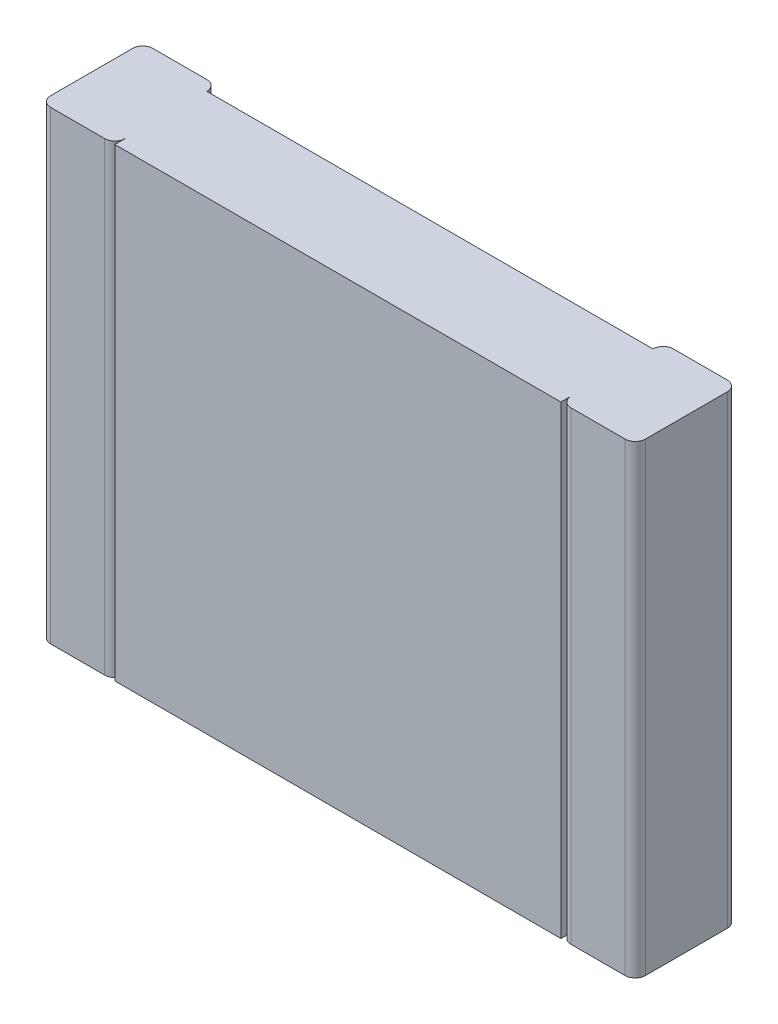
ISO-10303-21;
HEADER;
FILE_DESCRIPTION(('STEP AP214'),'2;1');
FILE_NAME('part.step','',(''),(''),'','','');
FILE_SCHEMA(('AUTOMOTIVE_DESIGN { 1 0 10303 214 1 1 1 1 }'));
ENDSEC;
DATA;
#1=APPLICATION_CONTEXT('core data for automotive mechanical design processes');
#2=APPLICATION_PROTOCOL_DEFINITION('international standard','automotive_design',2000,#1);
#3=PRODUCT_CONTEXT('',#1,'mechanical');
#4=PRODUCT('Part','Part','',(#3));
#5=PRODUCT_RELATED_PRODUCT_CATEGORY('part','',(#4));
#6=PRODUCT_DEFINITION_FORMATION('','',#4);
#7=PRODUCT_DEFINITION_CONTEXT('part definition',#1,'design');
#8=PRODUCT_DEFINITION('design','',#6,#7);
#9=PRODUCT_DEFINITION_SHAPE('','',#8);
#10=(LENGTH_UNIT() NAMED_UNIT(*) SI_UNIT(.MILLI.,.METRE.));
#11=(NAMED_UNIT(*) PLANE_ANGLE_UNIT() SI_UNIT($,.RADIAN.));
#12=(NAMED_UNIT(*) SI_UNIT($,.STERADIAN.) SOLID_ANGLE_UNIT());
#13=UNCERTAINTY_MEASURE_WITH_UNIT(LENGTH_MEASURE(1.E-05),#10,'distance_accuracy_value','');
#14=(GEOMETRIC_REPRESENTATION_CONTEXT(3) GLOBAL_UNCERTAINTY_ASSIGNED_CONTEXT((#13)) GLOBAL_UNIT_ASSIGNED_CONTEXT((#10,
#11,#12)) REPRESENTATION_CONTEXT('',''));
#15=CARTESIAN_POINT('',(0.,0.,0.));
#16=DIRECTION('',(0.,0.,1.));
#17=DIRECTION('',(1.,0.,0.));
#18=AXIS2_PLACEMENT_3D('',#15,#16,#17);
#19=CARTESIAN_POINT('',(-1.6,-1.25,0.55));
#20=DIRECTION('',(0.,0.,1.));
#21=DIRECTION('',(1.,0.,0.));
#22=AXIS2_PLACEMENT_3D('',#19,#20,#21);
#23=PLANE('',#22);
#24=DIRECTION('',(1.,0.,0.));
#25=VECTOR('',#24,1.);
#26=CARTESIAN_POINT('',(-1.6,-1.25,0.55));
#27=LINE('',#26,#25);
#28=CARTESIAN_POINT('',(-1.545,-1.25,0.55));
#29=VERTEX_POINT('',#28);
#30=CARTESIAN_POINT('',(-1.255,-1.25,0.55));
#31=VERTEX_POINT('',#30);
#32=EDGE_CURVE('E147',#29,#31,#27,.T.);
#33=ORIENTED_EDGE('',*,*,#32,.T.);
#34=DIRECTION('',(0.,1.,0.));
#35=VECTOR('',#34,1.);
#36=CARTESIAN_POINT('',(-1.255,-1.25,0.55));
#37=LINE('',#36,#35);
#38=CARTESIAN_POINT('',(-1.255,1.25,0.55));
#39=VERTEX_POINT('',#38);
#40=EDGE_CURVE('E172',#39,#31,#37,.F.);
#41=ORIENTED_EDGE('',*,*,#40,.F.);
#42=DIRECTION('',(1.,0.,0.));
#43=VECTOR('',#42,1.);
#44=CARTESIAN_POINT('',(-1.6,1.25,0.55));
#45=LINE('',#44,#43);
#46=CARTESIAN_POINT('',(-1.545,1.25,0.55));
#47=VERTEX_POINT('',#46);
#48=EDGE_CURVE('E178',#39,#47,#45,.F.);
#49=ORIENTED_EDGE('',*,*,#48,.T.);
#50=DIRECTION('',(0.,1.,0.));
#51=VECTOR('',#50,1.);
#52=CARTESIAN_POINT('',(-1.545,-1.25,0.55));
#53=LINE('',#52,#51);
#54=EDGE_CURVE('E151',#29,#47,#53,.T.);
#55=ORIENTED_EDGE('',*,*,#54,.F.);
#56=EDGE_LOOP('',(#33,#41,#49,#55));
#57=FACE_BOUND('',#56,.T.);
#58=ADVANCED_FACE('F17',(#57),#23,.T.);
#59=CARTESIAN_POINT('',(1.2,-1.25,0.55));
#60=DIRECTION('',(0.,0.,1.));
#61=DIRECTION('',(1.,0.,0.));
#62=AXIS2_PLACEMENT_3D('',#59,#60,#61);
#63=PLANE('',#62);
#64=DIRECTION('',(1.,0.,0.));
#65=VECTOR('',#64,1.);
#66=CARTESIAN_POINT('',(1.2,-1.25,0.55));
#67=LINE('',#66,#65);
#68=CARTESIAN_POINT('',(1.255,-1.25,0.55));
#69=VERTEX_POINT('',#68);
#70=CARTESIAN_POINT('',(1.545,-1.25,0.55));
#71=VERTEX_POINT('',#70);
#72=EDGE_CURVE('E152',#69,#71,#67,.T.);
#73=ORIENTED_EDGE('',*,*,#72,.T.);
#74=DIRECTION('',(0.,1.,0.));
#75=VECTOR('',#74,1.);
#76=CARTESIAN_POINT('',(1.545,-1.25,0.55));
#77=LINE('',#76,#75);
#78=CARTESIAN_POINT('',(1.545,1.25,0.55));
#79=VERTEX_POINT('',#78);
#80=EDGE_CURVE('E180',#79,#71,#77,.F.);
#81=ORIENTED_EDGE('',*,*,#80,.F.);
#82=DIRECTION('',(1.,0.,0.));
#83=VECTOR('',#82,1.);
#84=CARTESIAN_POINT('',(1.2,1.25,0.55));
#85=LINE('',#84,#83);
#86=CARTESIAN_POINT('',(1.255,1.25,0.55));
#87=VERTEX_POINT('',#86);
#88=EDGE_CURVE('E169',#79,#87,#85,.F.);
#89=ORIENTED_EDGE('',*,*,#88,.T.);
#90=DIRECTION('',(0.,1.,0.));
#91=VECTOR('',#90,1.);
#92=CARTESIAN_POINT('',(1.255,-1.25,0.55));
#93=LINE('',#92,#91);
#94=EDGE_CURVE('E165',#69,#87,#93,.T.);
#95=ORIENTED_EDGE('',*,*,#94,.F.);
#96=EDGE_LOOP('',(#73,#81,#89,#95));
#97=FACE_BOUND('',#96,.T.);
#98=ADVANCED_FACE('F226',(#97),#63,.T.);
#99=CARTESIAN_POINT('',(-1.545,-1.25,0.495));
#100=DIRECTION('',(0.,1.,0.));
#101=DIRECTION('',(0.,0.,1.));
#102=AXIS2_PLACEMENT_3D('',#99,#100,#101);
#103=CYLINDRICAL_SURFACE('',#102,0.055);
#104=CARTESIAN_POINT('',(-1.545,1.25,0.495));
#105=DIRECTION('',(0.,1.,0.));
#106=DIRECTION('',(0.,0.,1.));
#107=AXIS2_PLACEMENT_3D('',#104,#105,#106);
#108=CIRCLE('',#107,0.055);
#109=CARTESIAN_POINT('',(-1.6,1.25,0.495));
#110=VERTEX_POINT('',#109);
#111=EDGE_CURVE('E155',#47,#110,#108,.F.);
#112=ORIENTED_EDGE('',*,*,#111,.T.);
#113=DIRECTION('',(0.,1.,0.));
#114=VECTOR('',#113,1.);
#115=CARTESIAN_POINT('',(-1.6,-1.25,0.495));
#116=LINE('',#115,#114);
#117=CARTESIAN_POINT('',(-1.6,-1.25,0.495));
#118=VERTEX_POINT('',#117);
#119=EDGE_CURVE('E133',#110,#118,#116,.F.);
#120=ORIENTED_EDGE('',*,*,#119,.T.);
#121=CARTESIAN_POINT('',(-1.545,-1.25,0.495));
#122=DIRECTION('',(0.,1.,0.));
#123=DIRECTION('',(0.,0.,1.));
#124=AXIS2_PLACEMENT_3D('',#121,#122,#123);
#125=CIRCLE('',#124,0.055);
#126=EDGE_CURVE('E20',#118,#29,#125,.T.);
#127=ORIENTED_EDGE('',*,*,#126,.T.);
#128=ORIENTED_EDGE('',*,*,#54,.T.);
#129=EDGE_LOOP('',(#112,#120,#127,#128));
#130=FACE_BOUND('',#129,.T.);
#131=ADVANCED_FACE('F153',(#130),#103,.T.);
#132=CARTESIAN_POINT('',(1.545,-1.25,0.495));
#133=DIRECTION('',(0.,1.,0.));
#134=DIRECTION('',(0.,0.,1.));
#135=AXIS2_PLACEMENT_3D('',#132,#133,#134);
#136=CYLINDRICAL_SURFACE('',#135,0.055);
#137=ORIENTED_EDGE('',*,*,#80,.T.);
#138=CARTESIAN_POINT('',(1.545,-1.25,0.495));
#139=DIRECTION('',(0.,1.,0.));
#140=DIRECTION('',(0.,0.,1.));
#141=AXIS2_PLACEMENT_3D('',#138,#139,#140);
#142=CIRCLE('',#141,0.055);
#143=CARTESIAN_POINT('',(1.6,-1.25,0.495));
#144=VERTEX_POINT('',#143);
#145=EDGE_CURVE('E183',#71,#144,#142,.T.);
#146=ORIENTED_EDGE('',*,*,#145,.T.);
#147=DIRECTION('',(0.,1.,0.));
#148=VECTOR('',#147,1.);
#149=CARTESIAN_POINT('',(1.6,-1.25,0.495));
#150=LINE('',#149,#148);
#151=CARTESIAN_POINT('',(1.6,1.25,0.495));
#152=VERTEX_POINT('',#151);
#153=EDGE_CURVE('E163',#152,#144,#150,.F.);
#154=ORIENTED_EDGE('',*,*,#153,.F.);
#155=CARTESIAN_POINT('',(1.545,1.25,0.495));
#156=DIRECTION('',(0.,1.,0.));
#157=DIRECTION('',(0.,0.,1.));
#158=AXIS2_PLACEMENT_3D('',#155,#156,#157);
#159=CIRCLE('',#158,0.055);
#160=EDGE_CURVE('E184',#152,#79,#159,.F.);
#161=ORIENTED_EDGE('',*,*,#160,.T.);
#162=EDGE_LOOP('',(#137,#146,#154,#161));
#163=FACE_BOUND('',#162,.T.);
#164=ADVANCED_FACE('F216',(#163),#136,.T.);
#165=CARTESIAN_POINT('',(-1.255,-1.25,0.495));
#166=DIRECTION('',(0.,1.,0.));
#167=DIRECTION('',(0.,0.,1.));
#168=AXIS2_PLACEMENT_3D('',#165,#166,#167);
#169=CYLINDRICAL_SURFACE('',#168,0.055);
#170=ORIENTED_EDGE('',*,*,#40,.T.);
#171=CARTESIAN_POINT('',(-1.255,-1.25,0.495));
#172=DIRECTION('',(0.,1.,0.));
#173=DIRECTION('',(0.,0.,1.));
#174=AXIS2_PLACEMENT_3D('',#171,#172,#173);
#175=CIRCLE('',#174,0.055);
#176=CARTESIAN_POINT('',(-1.2,-1.25,0.495));
#177=VERTEX_POINT('',#176);
#178=EDGE_CURVE('E175',#31,#177,#175,.T.);
#179=ORIENTED_EDGE('',*,*,#178,.T.);
#180=DIRECTION('',(0.,1.,0.));
#181=VECTOR('',#180,1.);
#182=CARTESIAN_POINT('',(-1.2,-1.25,0.495));
#183=LINE('',#182,#181);
#184=CARTESIAN_POINT('',(-1.2,1.25,0.495));
#185=VERTEX_POINT('',#184);
#186=EDGE_CURVE('E239',#177,#185,#183,.T.);
#187=ORIENTED_EDGE('',*,*,#186,.T.);
#188=CARTESIAN_POINT('',(-1.255,1.25,0.495));
#189=DIRECTION('',(0.,1.,0.));
#190=DIRECTION('',(0.,0.,1.));
#191=AXIS2_PLACEMENT_3D('',#188,#189,#190);
#192=CIRCLE('',#191,0.055);
#193=EDGE_CURVE('E176',#185,#39,#192,.F.);
#194=ORIENTED_EDGE('',*,*,#193,.T.);
#195=EDGE_LOOP('',(#170,#179,#187,#194));
#196=FACE_BOUND('',#195,.T.);
#197=ADVANCED_FACE('F309',(#196),#169,.T.);
#198=CARTESIAN_POINT('',(1.255,-1.25,0.495));
#199=DIRECTION('',(0.,1.,0.));
#200=DIRECTION('',(0.,0.,1.));
#201=AXIS2_PLACEMENT_3D('',#198,#199,#200);
#202=CYLINDRICAL_SURFACE('',#201,0.055);
#203=CARTESIAN_POINT('',(1.255,1.25,0.495));
#204=DIRECTION('',(0.,1.,0.));
#205=DIRECTION('',(0.,0.,1.));
#206=AXIS2_PLACEMENT_3D('',#203,#204,#205);
#207=CIRCLE('',#206,0.055);
#208=CARTESIAN_POINT('',(1.2,1.25,0.495));
#209=VERTEX_POINT('',#208);
#210=EDGE_CURVE('E140',#87,#209,#207,.F.);
#211=ORIENTED_EDGE('',*,*,#210,.T.);
#212=DIRECTION('',(0.,1.,0.));
#213=VECTOR('',#212,1.);
#214=CARTESIAN_POINT('',(1.2,-1.25,0.495));
#215=LINE('',#214,#213);
#216=CARTESIAN_POINT('',(1.2,-1.25,0.495));
#217=VERTEX_POINT('',#216);
#218=EDGE_CURVE('E250',#217,#209,#215,.T.);
#219=ORIENTED_EDGE('',*,*,#218,.F.);
#220=CARTESIAN_POINT('',(1.255,-1.25,0.495));
#221=DIRECTION('',(0.,1.,0.));
#222=DIRECTION('',(0.,0.,1.));
#223=AXIS2_PLACEMENT_3D('',#220,#221,#222);
#224=CIRCLE('',#223,0.055);
#225=EDGE_CURVE('E168',#217,#69,#224,.T.);
#226=ORIENTED_EDGE('',*,*,#225,.T.);
#227=ORIENTED_EDGE('',*,*,#94,.T.);
#228=EDGE_LOOP('',(#211,#219,#226,#227));
#229=FACE_BOUND('',#228,.T.);
#230=ADVANCED_FACE('F478',(#229),#202,.T.);
#231=CARTESIAN_POINT('',(-1.6,-1.25,0.));
#232=DIRECTION('',(1.,0.,0.));
#233=DIRECTION('',(0.,0.,-1.));
#234=AXIS2_PLACEMENT_3D('',#231,#232,#233);
#235=PLANE('',#234);
#236=DIRECTION('',(0.,0.,-1.));
#237=VECTOR('',#236,1.);
#238=CARTESIAN_POINT('',(-1.6,1.25,0.));
#239=LINE('',#238,#237);
#240=CARTESIAN_POINT('',(-1.6,1.25,0.055));
#241=VERTEX_POINT('',#240);
#242=EDGE_CURVE('E139',#241,#110,#239,.F.);
#243=ORIENTED_EDGE('',*,*,#242,.F.);
#244=DIRECTION('',(0.,1.,0.));
#245=VECTOR('',#244,1.);
#246=CARTESIAN_POINT('',(-1.6,-1.25,0.055));
#247=LINE('',#246,#245);
#248=CARTESIAN_POINT('',(-1.6,-1.25,0.055));
#249=VERTEX_POINT('',#248);
#250=EDGE_CURVE('E136',#249,#241,#247,.T.);
#251=ORIENTED_EDGE('',*,*,#250,.F.);
#252=DIRECTION('',(0.,0.,-1.));
#253=VECTOR('',#252,1.);
#254=CARTESIAN_POINT('',(-1.6,-1.25,0.));
#255=LINE('',#254,#253);
#256=EDGE_CURVE('E129',#118,#249,#255,.T.);
#257=ORIENTED_EDGE('',*,*,#256,.F.);
#258=ORIENTED_EDGE('',*,*,#119,.F.);
#259=EDGE_LOOP('',(#243,#251,#257,#258));
#260=FACE_BOUND('',#259,.T.);
#261=ADVANCED_FACE('F131',(#260),#235,.F.);
#262=CARTESIAN_POINT('',(1.6,-1.25,0.));
#263=DIRECTION('',(1.,0.,0.));
#264=DIRECTION('',(0.,0.,-1.));
#265=AXIS2_PLACEMENT_3D('',#262,#263,#264);
#266=PLANE('',#265);
#267=DIRECTION('',(0.,0.,-1.));
#268=VECTOR('',#267,1.);
#269=CARTESIAN_POINT('',(1.6,1.25,0.));
#270=LINE('',#269,#268);
#271=CARTESIAN_POINT('',(1.6,1.25,0.055));
#272=VERTEX_POINT('',#271);
#273=EDGE_CURVE('E158',#272,#152,#270,.F.);
#274=ORIENTED_EDGE('',*,*,#273,.T.);
#275=ORIENTED_EDGE('',*,*,#153,.T.);
#276=DIRECTION('',(0.,0.,-1.));
#277=VECTOR('',#276,1.);
#278=CARTESIAN_POINT('',(1.6,-1.25,0.));
#279=LINE('',#278,#277);
#280=CARTESIAN_POINT('',(1.6,-1.25,0.055));
#281=VERTEX_POINT('',#280);
#282=EDGE_CURVE('E156',#144,#281,#279,.T.);
#283=ORIENTED_EDGE('',*,*,#282,.T.);
#284=DIRECTION('',(0.,1.,0.));
#285=VECTOR('',#284,1.);
#286=CARTESIAN_POINT('',(1.6,-1.25,0.055));
#287=LINE('',#286,#285);
#288=EDGE_CURVE('E200',#272,#281,#287,.F.);
#289=ORIENTED_EDGE('',*,*,#288,.F.);
#290=EDGE_LOOP('',(#274,#275,#283,#289));
#291=FACE_BOUND('',#290,.T.);
#292=ADVANCED_FACE('F234',(#291),#266,.T.);
#293=CARTESIAN_POINT('',(-1.2,-1.25,0.495));
#294=DIRECTION('',(1.,0.,0.));
#295=DIRECTION('',(0.,0.,-1.));
#296=AXIS2_PLACEMENT_3D('',#293,#294,#295);
#297=PLANE('',#296);
#298=DIRECTION('',(0.,0.,-1.));
#299=VECTOR('',#298,1.);
#300=CARTESIAN_POINT('',(-1.2,1.25,0.495));
#301=LINE('',#300,#299);
#302=CARTESIAN_POINT('',(-1.2,1.25,0.55));
#303=VERTEX_POINT('',#302);
#304=EDGE_CURVE('E270',#185,#303,#301,.F.);
#305=ORIENTED_EDGE('',*,*,#304,.F.);
#306=ORIENTED_EDGE('',*,*,#186,.F.);
#307=DIRECTION('',(0.,0.,-1.));
#308=VECTOR('',#307,1.);
#309=CARTESIAN_POINT('',(-1.2,-1.25,0.495));
#310=LINE('',#309,#308);
#311=CARTESIAN_POINT('',(-1.2,-1.25,0.55));
#312=VERTEX_POINT('',#311);
#313=EDGE_CURVE('E237',#312,#177,#310,.T.);
#314=ORIENTED_EDGE('',*,*,#313,.F.);
#315=DIRECTION('',(0.,1.,0.));
#316=VECTOR('',#315,1.);
#317=CARTESIAN_POINT('',(-1.2,-1.25,0.55));
#318=LINE('',#317,#316);
#319=EDGE_CURVE('E246',#303,#312,#318,.F.);
#320=ORIENTED_EDGE('',*,*,#319,.F.);
#321=EDGE_LOOP('',(#305,#306,#314,#320));
#322=FACE_BOUND('',#321,.T.);
#323=ADVANCED_FACE('F307',(#322),#297,.F.);
#324=CARTESIAN_POINT('',(1.2,-1.25,0.495));
#325=DIRECTION('',(1.,0.,0.));
#326=DIRECTION('',(0.,0.,-1.));
#327=AXIS2_PLACEMENT_3D('',#324,#325,#326);
#328=PLANE('',#327);
#329=DIRECTION('',(0.,0.,-1.));
#330=VECTOR('',#329,1.);
#331=CARTESIAN_POINT('',(1.2,1.25,0.495));
#332=LINE('',#331,#330);
#333=CARTESIAN_POINT('',(1.2,1.25,0.55));
#334=VERTEX_POINT('',#333);
#335=EDGE_CURVE('E248',#209,#334,#332,.F.);
#336=ORIENTED_EDGE('',*,*,#335,.T.);
#337=DIRECTION('',(0.,1.,0.));
#338=VECTOR('',#337,1.);
#339=CARTESIAN_POINT('',(1.2,-1.25,0.55));
#340=LINE('',#339,#338);
#341=CARTESIAN_POINT('',(1.2,-1.25,0.55));
#342=VERTEX_POINT('',#341);
#343=EDGE_CURVE('E258',#342,#334,#340,.T.);
#344=ORIENTED_EDGE('',*,*,#343,.F.);
#345=DIRECTION('',(0.,0.,-1.));
#346=VECTOR('',#345,1.);
#347=CARTESIAN_POINT('',(1.2,-1.25,0.495));
#348=LINE('',#347,#346);
#349=EDGE_CURVE('E253',#342,#217,#348,.T.);
#350=ORIENTED_EDGE('',*,*,#349,.T.);
#351=ORIENTED_EDGE('',*,*,#218,.T.);
#352=EDGE_LOOP('',(#336,#344,#350,#351));
#353=FACE_BOUND('',#352,.T.);
#354=ADVANCED_FACE('F302',(#353),#328,.T.);
#355=CARTESIAN_POINT('',(-1.545,-1.25,0.055));
#356=DIRECTION('',(0.,1.,0.));
#357=DIRECTION('',(0.,0.,1.));
#358=AXIS2_PLACEMENT_3D('',#355,#356,#357);
#359=CYLINDRICAL_SURFACE('',#358,0.055);
#360=DIRECTION('',(0.,1.,0.));
#361=VECTOR('',#360,1.);
#362=CARTESIAN_POINT('',(-1.545,-1.25,0.));
#363=LINE('',#362,#361);
#364=CARTESIAN_POINT('',(-1.545,1.25,0.));
#365=VERTEX_POINT('',#364);
#366=CARTESIAN_POINT('',(-1.545,-1.25,0.));
#367=VERTEX_POINT('',#366);
#368=EDGE_CURVE('E244',#365,#367,#363,.F.);
#369=ORIENTED_EDGE('',*,*,#368,.T.);
#370=CARTESIAN_POINT('',(-1.545,-1.25,0.055));
#371=DIRECTION('',(0.,1.,0.));
#372=DIRECTION('',(0.,0.,1.));
#373=AXIS2_PLACEMENT_3D('',#370,#371,#372);
#374=CIRCLE('',#373,0.055);
#375=EDGE_CURVE('E203',#367,#249,#374,.T.);
#376=ORIENTED_EDGE('',*,*,#375,.T.);
#377=ORIENTED_EDGE('',*,*,#250,.T.);
#378=CARTESIAN_POINT('',(-1.545,1.25,0.055));
#379=DIRECTION('',(0.,1.,0.));
#380=DIRECTION('',(0.,0.,1.));
#381=AXIS2_PLACEMENT_3D('',#378,#379,#380);
#382=CIRCLE('',#381,0.055);
#383=EDGE_CURVE('E205',#241,#365,#382,.F.);
#384=ORIENTED_EDGE('',*,*,#383,.T.);
#385=EDGE_LOOP('',(#369,#376,#377,#384));
#386=FACE_BOUND('',#385,.T.);
#387=ADVANCED_FACE('F316',(#386),#359,.T.);
#388=CARTESIAN_POINT('',(1.545,-1.25,0.055));
#389=DIRECTION('',(0.,1.,0.));
#390=DIRECTION('',(0.,0.,1.));
#391=AXIS2_PLACEMENT_3D('',#388,#389,#390);
#392=CYLINDRICAL_SURFACE('',#391,0.055);
#393=CARTESIAN_POINT('',(1.545,1.25,0.055));
#394=DIRECTION('',(0.,1.,0.));
#395=DIRECTION('',(0.,0.,1.));
#396=AXIS2_PLACEMENT_3D('',#393,#394,#395);
#397=CIRCLE('',#396,0.055);
#398=CARTESIAN_POINT('',(1.545,1.25,0.));
#399=VERTEX_POINT('',#398);
#400=EDGE_CURVE('E198',#399,#272,#397,.F.);
#401=ORIENTED_EDGE('',*,*,#400,.T.);
#402=ORIENTED_EDGE('',*,*,#288,.T.);
#403=CARTESIAN_POINT('',(1.545,-1.25,0.055));
#404=DIRECTION('',(0.,1.,0.));
#405=DIRECTION('',(0.,0.,1.));
#406=AXIS2_PLACEMENT_3D('',#403,#404,#405);
#407=CIRCLE('',#406,0.055);
#408=CARTESIAN_POINT('',(1.545,-1.25,0.));
#409=VERTEX_POINT('',#408);
#410=EDGE_CURVE('E201',#281,#409,#407,.T.);
#411=ORIENTED_EDGE('',*,*,#410,.T.);
#412=DIRECTION('',(0.,1.,0.));
#413=VECTOR('',#412,1.);
#414=CARTESIAN_POINT('',(1.545,-1.25,0.));
#415=LINE('',#414,#413);
#416=EDGE_CURVE('E276',#409,#399,#415,.T.);
#417=ORIENTED_EDGE('',*,*,#416,.T.);
#418=EDGE_LOOP('',(#401,#402,#411,#417));
#419=FACE_BOUND('',#418,.T.);
#420=ADVANCED_FACE('F436',(#419),#392,.T.);
#421=CARTESIAN_POINT('',(-1.2,-1.25,0.55));
#422=DIRECTION('',(0.,0.,1.));
#423=DIRECTION('',(1.,0.,0.));
#424=AXIS2_PLACEMENT_3D('',#421,#422,#423);
#425=PLANE('',#424);
#426=ORIENTED_EDGE('',*,*,#343,.T.);
#427=DIRECTION('',(1.,0.,0.));
#428=VECTOR('',#427,1.);
#429=CARTESIAN_POINT('',(-1.2,1.25,0.55));
#430=LINE('',#429,#428);
#431=EDGE_CURVE('E263',#303,#334,#430,.T.);
#432=ORIENTED_EDGE('',*,*,#431,.F.);
#433=ORIENTED_EDGE('',*,*,#319,.T.);
#434=DIRECTION('',(1.,0.,0.));
#435=VECTOR('',#434,1.);
#436=CARTESIAN_POINT('',(-1.2,-1.25,0.55));
#437=LINE('',#436,#435);
#438=EDGE_CURVE('E273',#312,#342,#437,.T.);
#439=ORIENTED_EDGE('',*,*,#438,.T.);
#440=EDGE_LOOP('',(#426,#432,#433,#439));
#441=FACE_BOUND('',#440,.T.);
#442=ADVANCED_FACE('F294',(#441),#425,.T.);
#443=CARTESIAN_POINT('',(-1.6,-1.25,0.));
#444=DIRECTION('',(0.,0.,1.));
#445=DIRECTION('',(1.,0.,0.));
#446=AXIS2_PLACEMENT_3D('',#443,#444,#445);
#447=PLANE('',#446);
#448=DIRECTION('',(1.,0.,0.));
#449=VECTOR('',#448,1.);
#450=CARTESIAN_POINT('',(-1.6,-1.25,0.));
#451=LINE('',#450,#449);
#452=CARTESIAN_POINT('',(-1.255,-1.25,0.));
#453=VERTEX_POINT('',#452);
#454=EDGE_CURVE('E277',#453,#367,#451,.F.);
#455=ORIENTED_EDGE('',*,*,#454,.T.);
#456=ORIENTED_EDGE('',*,*,#368,.F.);
#457=DIRECTION('',(1.,0.,0.));
#458=VECTOR('',#457,1.);
#459=CARTESIAN_POINT('',(-1.6,1.25,0.));
#460=LINE('',#459,#458);
#461=CARTESIAN_POINT('',(-1.255,1.25,0.));
#462=VERTEX_POINT('',#461);
#463=EDGE_CURVE('E266',#462,#365,#460,.F.);
#464=ORIENTED_EDGE('',*,*,#463,.F.);
#465=DIRECTION('',(0.,1.,0.));
#466=VECTOR('',#465,1.);
#467=CARTESIAN_POINT('',(-1.255,-1.25,0.));
#468=LINE('',#467,#466);
#469=EDGE_CURVE('E193',#453,#462,#468,.T.);
#470=ORIENTED_EDGE('',*,*,#469,.F.);
#471=EDGE_LOOP('',(#455,#456,#464,#470));
#472=FACE_BOUND('',#471,.T.);
#473=ADVANCED_FACE('F328',(#472),#447,.F.);
#474=CARTESIAN_POINT('',(1.2,-1.25,0.));
#475=DIRECTION('',(0.,0.,1.));
#476=DIRECTION('',(1.,0.,0.));
#477=AXIS2_PLACEMENT_3D('',#474,#475,#476);
#478=PLANE('',#477);
#479=DIRECTION('',(1.,0.,0.));
#480=VECTOR('',#479,1.);
#481=CARTESIAN_POINT('',(1.2,-1.25,0.));
#482=LINE('',#481,#480);
#483=CARTESIAN_POINT('',(1.255,-1.25,0.));
#484=VERTEX_POINT('',#483);
#485=EDGE_CURVE('E333',#409,#484,#482,.F.);
#486=ORIENTED_EDGE('',*,*,#485,.T.);
#487=DIRECTION('',(0.,1.,0.));
#488=VECTOR('',#487,1.);
#489=CARTESIAN_POINT('',(1.255,-1.25,0.));
#490=LINE('',#489,#488);
#491=CARTESIAN_POINT('',(1.255,1.25,0.));
#492=VERTEX_POINT('',#491);
#493=EDGE_CURVE('E189',#492,#484,#490,.F.);
#494=ORIENTED_EDGE('',*,*,#493,.F.);
#495=DIRECTION('',(1.,0.,0.));
#496=VECTOR('',#495,1.);
#497=CARTESIAN_POINT('',(1.2,1.25,0.));
#498=LINE('',#497,#496);
#499=EDGE_CURVE('E197',#399,#492,#498,.F.);
#500=ORIENTED_EDGE('',*,*,#499,.F.);
#501=ORIENTED_EDGE('',*,*,#416,.F.);
#502=EDGE_LOOP('',(#486,#494,#500,#501));
#503=FACE_BOUND('',#502,.T.);
#504=ADVANCED_FACE('F354',(#503),#478,.F.);
#505=CARTESIAN_POINT('',(-1.255,-1.25,0.055));
#506=DIRECTION('',(0.,1.,0.));
#507=DIRECTION('',(0.,0.,1.));
#508=AXIS2_PLACEMENT_3D('',#505,#506,#507);
#509=CYLINDRICAL_SURFACE('',#508,0.055);
#510=CARTESIAN_POINT('',(-1.255,1.25,0.055));
#511=DIRECTION('',(0.,1.,0.));
#512=DIRECTION('',(0.,0.,1.));
#513=AXIS2_PLACEMENT_3D('',#510,#511,#512);
#514=CIRCLE('',#513,0.055);
#515=CARTESIAN_POINT('',(-1.2,1.25,0.055));
#516=VERTEX_POINT('',#515);
#517=EDGE_CURVE('E191',#462,#516,#514,.F.);
#518=ORIENTED_EDGE('',*,*,#517,.T.);
#519=DIRECTION('',(0.,1.,0.));
#520=VECTOR('',#519,1.);
#521=CARTESIAN_POINT('',(-1.2,-1.25,0.055));
#522=LINE('',#521,#520);
#523=CARTESIAN_POINT('',(-1.2,-1.25,0.055));
#524=VERTEX_POINT('',#523);
#525=EDGE_CURVE('E188',#516,#524,#522,.F.);
#526=ORIENTED_EDGE('',*,*,#525,.T.);
#527=CARTESIAN_POINT('',(-1.255,-1.25,0.055));
#528=DIRECTION('',(0.,1.,0.));
#529=DIRECTION('',(0.,0.,1.));
#530=AXIS2_PLACEMENT_3D('',#527,#528,#529);
#531=CIRCLE('',#530,0.055);
#532=EDGE_CURVE('E194',#524,#453,#531,.T.);
#533=ORIENTED_EDGE('',*,*,#532,.T.);
#534=ORIENTED_EDGE('',*,*,#469,.T.);
#535=EDGE_LOOP('',(#518,#526,#533,#534));
#536=FACE_BOUND('',#535,.T.);
#537=ADVANCED_FACE('F325',(#536),#509,.T.);
#538=CARTESIAN_POINT('',(-1.545,-1.25,0.055));
#539=DIRECTION('',(0.,1.,0.));
#540=DIRECTION('',(0.,0.,1.));
#541=AXIS2_PLACEMENT_3D('',#538,#539,#540);
#542=PLANE('',#541);
#543=DIRECTION('',(1.,0.,0.));
#544=VECTOR('',#543,1.);
#545=CARTESIAN_POINT('',(-1.545,-1.25,0.055));
#546=LINE('',#545,#544);
#547=CARTESIAN_POINT('',(1.2,-1.25,0.055));
#548=VERTEX_POINT('',#547);
#549=EDGE_CURVE('E347',#524,#548,#546,.T.);
#550=ORIENTED_EDGE('',*,*,#549,.T.);
#551=CARTESIAN_POINT('',(1.255,-1.25,0.055));
#552=DIRECTION('',(0.,1.,0.));
#553=DIRECTION('',(0.,0.,1.));
#554=AXIS2_PLACEMENT_3D('',#551,#552,#553);
#555=CIRCLE('',#554,0.055);
#556=EDGE_CURVE('E186',#484,#548,#555,.T.);
#557=ORIENTED_EDGE('',*,*,#556,.F.);
#558=ORIENTED_EDGE('',*,*,#485,.F.);
#559=ORIENTED_EDGE('',*,*,#410,.F.);
#560=ORIENTED_EDGE('',*,*,#282,.F.);
#561=ORIENTED_EDGE('',*,*,#145,.F.);
#562=ORIENTED_EDGE('',*,*,#72,.F.);
#563=ORIENTED_EDGE('',*,*,#225,.F.);
#564=ORIENTED_EDGE('',*,*,#349,.F.);
#565=ORIENTED_EDGE('',*,*,#438,.F.);
#566=ORIENTED_EDGE('',*,*,#313,.T.);
#567=ORIENTED_EDGE('',*,*,#178,.F.);
#568=ORIENTED_EDGE('',*,*,#32,.F.);
#569=ORIENTED_EDGE('',*,*,#126,.F.);
#570=ORIENTED_EDGE('',*,*,#256,.T.);
#571=ORIENTED_EDGE('',*,*,#375,.F.);
#572=ORIENTED_EDGE('',*,*,#454,.F.);
#573=ORIENTED_EDGE('',*,*,#532,.F.);
#574=EDGE_LOOP('',(#550,#557,#558,#559,#560,#561,#562,#563,#564,#565,#566,#567,#568,#569,#570,
#571,#572,#573));
#575=FACE_BOUND('',#574,.T.);
#576=ADVANCED_FACE('F145',(#575),#542,.F.);
#577=CARTESIAN_POINT('',(1.255,-1.25,0.055));
#578=DIRECTION('',(0.,1.,0.));
#579=DIRECTION('',(0.,0.,1.));
#580=AXIS2_PLACEMENT_3D('',#577,#578,#579);
#581=CYLINDRICAL_SURFACE('',#580,0.055);
#582=ORIENTED_EDGE('',*,*,#493,.T.);
#583=ORIENTED_EDGE('',*,*,#556,.T.);
#584=DIRECTION('',(0.,1.,0.));
#585=VECTOR('',#584,1.);
#586=CARTESIAN_POINT('',(1.2,-1.25,0.055));
#587=LINE('',#586,#585);
#588=CARTESIAN_POINT('',(1.2,1.25,0.055));
#589=VERTEX_POINT('',#588);
#590=EDGE_CURVE('E26',#548,#589,#587,.T.);
#591=ORIENTED_EDGE('',*,*,#590,.T.);
#592=CARTESIAN_POINT('',(1.255,1.25,0.055));
#593=DIRECTION('',(0.,1.,0.));
#594=DIRECTION('',(0.,0.,1.));
#595=AXIS2_PLACEMENT_3D('',#592,#593,#594);
#596=CIRCLE('',#595,0.055);
#597=EDGE_CURVE('E34',#589,#492,#596,.F.);
#598=ORIENTED_EDGE('',*,*,#597,.T.);
#599=EDGE_LOOP('',(#582,#583,#591,#598));
#600=FACE_BOUND('',#599,.T.);
#601=ADVANCED_FACE('F353',(#600),#581,.T.);
#602=CARTESIAN_POINT('',(-1.545,1.25,0.055));
#603=DIRECTION('',(0.,1.,0.));
#604=DIRECTION('',(0.,0.,1.));
#605=AXIS2_PLACEMENT_3D('',#602,#603,#604);
#606=PLANE('',#605);
#607=DIRECTION('',(1.,0.,0.));
#608=VECTOR('',#607,1.);
#609=CARTESIAN_POINT('',(-1.545,1.25,0.055));
#610=LINE('',#609,#608);
#611=EDGE_CURVE('E11',#589,#516,#610,.F.);
#612=ORIENTED_EDGE('',*,*,#611,.T.);
#613=ORIENTED_EDGE('',*,*,#517,.F.);
#614=ORIENTED_EDGE('',*,*,#463,.T.);
#615=ORIENTED_EDGE('',*,*,#383,.F.);
#616=ORIENTED_EDGE('',*,*,#242,.T.);
#617=ORIENTED_EDGE('',*,*,#111,.F.);
#618=ORIENTED_EDGE('',*,*,#48,.F.);
#619=ORIENTED_EDGE('',*,*,#193,.F.);
#620=ORIENTED_EDGE('',*,*,#304,.T.);
#621=ORIENTED_EDGE('',*,*,#431,.T.);
#622=ORIENTED_EDGE('',*,*,#335,.F.);
#623=ORIENTED_EDGE('',*,*,#210,.F.);
#624=ORIENTED_EDGE('',*,*,#88,.F.);
#625=ORIENTED_EDGE('',*,*,#160,.F.);
#626=ORIENTED_EDGE('',*,*,#273,.F.);
#627=ORIENTED_EDGE('',*,*,#400,.F.);
#628=ORIENTED_EDGE('',*,*,#499,.T.);
#629=ORIENTED_EDGE('',*,*,#597,.F.);
#630=EDGE_LOOP('',(#612,#613,#614,#615,#616,#617,#618,#619,#620,#621,#622,#623,#624,#625,#626,
#627,#628,#629));
#631=FACE_BOUND('',#630,.T.);
#632=ADVANCED_FACE('F222',(#631),#606,.T.);
#633=CARTESIAN_POINT('',(-1.545,-1.25,0.055));
#634=DIRECTION('',(0.,0.,1.));
#635=DIRECTION('',(1.,0.,0.));
#636=AXIS2_PLACEMENT_3D('',#633,#634,#635);
#637=PLANE('',#636);
#638=ORIENTED_EDGE('',*,*,#590,.F.);
#639=ORIENTED_EDGE('',*,*,#549,.F.);
#640=ORIENTED_EDGE('',*,*,#525,.F.);
#641=ORIENTED_EDGE('',*,*,#611,.F.);
#642=EDGE_LOOP('',(#638,#639,#640,#641));
#643=FACE_BOUND('',#642,.T.);
#644=ADVANCED_FACE('F364',(#643),#637,.F.);
#645=CLOSED_SHELL('',(#58,#98,#131,#164,#197,#230,#261,#292,#323,#354,#387,#420,#442,#473,#504,
#537,#576,#601,#632,#644));
#646=MANIFOLD_SOLID_BREP('B1',#645);
#647=ADVANCED_BREP_SHAPE_REPRESENTATION('',(#18,#646),#14);
#648=SHAPE_DEFINITION_REPRESENTATION(#9,#647);
ENDSEC;
END-ISO-10303-21;
